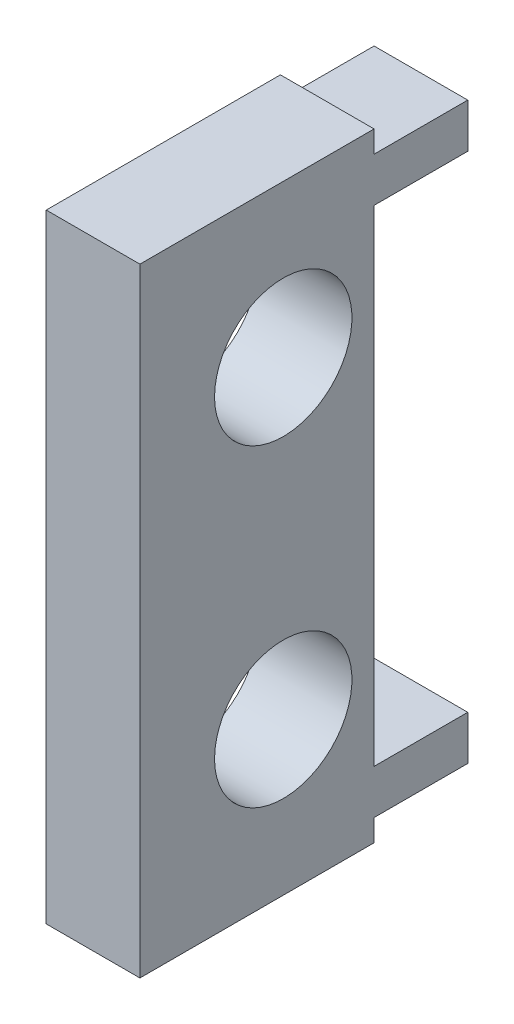
ISO-10303-21;
HEADER;
FILE_DESCRIPTION(('STEP AP214'),'2;1');
FILE_NAME('part.step','',(''),(''),'','','');
FILE_SCHEMA(('AUTOMOTIVE_DESIGN { 1 0 10303 214 1 1 1 1 }'));
ENDSEC;
DATA;
#1=APPLICATION_CONTEXT('core data for automotive mechanical design processes');
#2=APPLICATION_PROTOCOL_DEFINITION('international standard','automotive_design',2000,#1);
#3=PRODUCT_CONTEXT('',#1,'mechanical');
#4=PRODUCT('Part','Part','',(#3));
#5=PRODUCT_RELATED_PRODUCT_CATEGORY('part','',(#4));
#6=PRODUCT_DEFINITION_FORMATION('','',#4);
#7=PRODUCT_DEFINITION_CONTEXT('part definition',#1,'design');
#8=PRODUCT_DEFINITION('design','',#6,#7);
#9=PRODUCT_DEFINITION_SHAPE('','',#8);
#10=(LENGTH_UNIT() NAMED_UNIT(*) SI_UNIT(.MILLI.,.METRE.));
#11=(NAMED_UNIT(*) PLANE_ANGLE_UNIT() SI_UNIT($,.RADIAN.));
#12=(NAMED_UNIT(*) SI_UNIT($,.STERADIAN.) SOLID_ANGLE_UNIT());
#13=UNCERTAINTY_MEASURE_WITH_UNIT(LENGTH_MEASURE(1.E-05),#10,'distance_accuracy_value','');
#14=(GEOMETRIC_REPRESENTATION_CONTEXT(3) GLOBAL_UNCERTAINTY_ASSIGNED_CONTEXT((#13)) GLOBAL_UNIT_ASSIGNED_CONTEXT((#10,
#11,#12)) REPRESENTATION_CONTEXT('',''));
#15=CARTESIAN_POINT('',(0.,0.,0.));
#16=DIRECTION('',(0.,0.,1.));
#17=DIRECTION('',(1.,0.,0.));
#18=AXIS2_PLACEMENT_3D('',#15,#16,#17);
#19=CARTESIAN_POINT('',(0.,0.,0.));
#20=DIRECTION('',(0.,0.,-1.));
#21=DIRECTION('',(-1.,0.,0.));
#22=AXIS2_PLACEMENT_3D('',#19,#20,#21);
#23=PLANE('',#22);
#24=DIRECTION('',(0.,1.,0.));
#25=VECTOR('',#24,1.);
#26=CARTESIAN_POINT('',(1.5,-9.9,0.));
#27=LINE('',#26,#25);
#28=CARTESIAN_POINT('',(1.50000000000004,9.19999999999999,0.));
#29=VERTEX_POINT('',#28);
#30=CARTESIAN_POINT('',(1.5,9.9,0.));
#31=VERTEX_POINT('',#30);
#32=EDGE_CURVE('E176',#29,#31,#27,.T.);
#33=ORIENTED_EDGE('',*,*,#32,.F.);
#34=DIRECTION('',(1.,0.,0.));
#35=VECTOR('',#34,1.);
#36=CARTESIAN_POINT('',(1.50000000000004,9.19999999999999,0.));
#37=LINE('',#36,#35);
#38=CARTESIAN_POINT('',(-1.49999999999996,9.2,0.));
#39=VERTEX_POINT('',#38);
#40=EDGE_CURVE('E144',#39,#29,#37,.T.);
#41=ORIENTED_EDGE('',*,*,#40,.F.);
#42=DIRECTION('',(0.,-1.,0.));
#43=VECTOR('',#42,1.);
#44=CARTESIAN_POINT('',(-1.5,-9.9,0.));
#45=LINE('',#44,#43);
#46=CARTESIAN_POINT('',(-1.5,9.9,0.));
#47=VERTEX_POINT('',#46);
#48=EDGE_CURVE('E193',#47,#39,#45,.T.);
#49=ORIENTED_EDGE('',*,*,#48,.F.);
#50=DIRECTION('',(-1.,0.,0.));
#51=VECTOR('',#50,1.);
#52=CARTESIAN_POINT('',(-1.5,9.9,0.));
#53=LINE('',#52,#51);
#54=EDGE_CURVE('E190',#31,#47,#53,.T.);
#55=ORIENTED_EDGE('',*,*,#54,.F.);
#56=EDGE_LOOP('',(#33,#41,#49,#55));
#57=FACE_BOUND('',#56,.T.);
#58=ADVANCED_FACE('F33',(#57),#23,.T.);
#59=CARTESIAN_POINT('',(-1.5,7.78,0.));
#60=VERTEX_POINT('',#59);
#61=CARTESIAN_POINT('',(-1.5,-7.78,0.));
#62=VERTEX_POINT('',#61);
#63=EDGE_CURVE('E196',#60,#62,#45,.T.);
#64=ORIENTED_EDGE('',*,*,#63,.F.);
#65=DIRECTION('',(-1.,0.,0.));
#66=VECTOR('',#65,1.);
#67=CARTESIAN_POINT('',(1.50000000000004,7.77999999999999,0.));
#68=LINE('',#67,#66);
#69=CARTESIAN_POINT('',(1.50000000000004,7.77999999999999,0.));
#70=VERTEX_POINT('',#69);
#71=EDGE_CURVE('E140',#70,#60,#68,.T.);
#72=ORIENTED_EDGE('',*,*,#71,.F.);
#73=CARTESIAN_POINT('',(1.5,-7.78,0.));
#74=VERTEX_POINT('',#73);
#75=EDGE_CURVE('E191',#74,#70,#27,.T.);
#76=ORIENTED_EDGE('',*,*,#75,.F.);
#77=DIRECTION('',(1.,0.,0.));
#78=VECTOR('',#77,1.);
#79=CARTESIAN_POINT('',(1.5,-7.78,0.));
#80=LINE('',#79,#78);
#81=EDGE_CURVE('E146',#62,#74,#80,.T.);
#82=ORIENTED_EDGE('',*,*,#81,.F.);
#83=EDGE_LOOP('',(#64,#72,#76,#82));
#84=FACE_BOUND('',#83,.T.);
#85=ADVANCED_FACE('F257',(#84),#23,.T.);
#86=DIRECTION('',(-1.,0.,0.));
#87=VECTOR('',#86,1.);
#88=CARTESIAN_POINT('',(1.5,-9.2,0.));
#89=LINE('',#88,#87);
#90=CARTESIAN_POINT('',(1.5,-9.2,0.));
#91=VERTEX_POINT('',#90);
#92=CARTESIAN_POINT('',(-1.5,-9.2,0.));
#93=VERTEX_POINT('',#92);
#94=EDGE_CURVE('E149',#91,#93,#89,.T.);
#95=ORIENTED_EDGE('',*,*,#94,.F.);
#96=CARTESIAN_POINT('',(1.5,-9.9,0.));
#97=VERTEX_POINT('',#96);
#98=EDGE_CURVE('E188',#97,#91,#27,.T.);
#99=ORIENTED_EDGE('',*,*,#98,.F.);
#100=DIRECTION('',(1.,0.,0.));
#101=VECTOR('',#100,1.);
#102=CARTESIAN_POINT('',(-1.5,-9.9,0.));
#103=LINE('',#102,#101);
#104=CARTESIAN_POINT('',(-1.5,-9.9,0.));
#105=VERTEX_POINT('',#104);
#106=EDGE_CURVE('E181',#105,#97,#103,.T.);
#107=ORIENTED_EDGE('',*,*,#106,.F.);
#108=EDGE_CURVE('E56',#93,#105,#45,.T.);
#109=ORIENTED_EDGE('',*,*,#108,.F.);
#110=EDGE_LOOP('',(#95,#99,#107,#109));
#111=FACE_BOUND('',#110,.T.);
#112=ADVANCED_FACE('F259',(#111),#23,.T.);
#113=CARTESIAN_POINT('',(1.5,-9.9,7.5));
#114=DIRECTION('',(-1.,0.,0.));
#115=DIRECTION('',(0.,0.,1.));
#116=AXIS2_PLACEMENT_3D('',#113,#114,#115);
#117=PLANE('',#116);
#118=CARTESIAN_POINT('',(1.5,5.02,2.91));
#119=DIRECTION('',(-1.,0.,0.));
#120=DIRECTION('',(0.,0.,1.));
#121=AXIS2_PLACEMENT_3D('',#118,#119,#120);
#122=CIRCLE('',#121,2.2);
#123=CARTESIAN_POINT('',(1.5,5.02,5.11));
#124=VERTEX_POINT('',#123);
#125=EDGE_CURVE('E223',#124,#124,#122,.T.);
#126=ORIENTED_EDGE('',*,*,#125,.T.);
#127=EDGE_LOOP('',(#126));
#128=FACE_BOUND('',#127,.T.);
#129=CARTESIAN_POINT('',(1.5,-5.02,2.91));
#130=DIRECTION('',(-1.,0.,0.));
#131=DIRECTION('',(0.,0.,1.));
#132=AXIS2_PLACEMENT_3D('',#129,#130,#131);
#133=CIRCLE('',#132,2.2);
#134=CARTESIAN_POINT('',(1.5,-5.02,5.11));
#135=VERTEX_POINT('',#134);
#136=EDGE_CURVE('E211',#135,#135,#133,.T.);
#137=ORIENTED_EDGE('',*,*,#136,.T.);
#138=EDGE_LOOP('',(#137));
#139=FACE_BOUND('',#138,.T.);
#140=ORIENTED_EDGE('',*,*,#98,.T.);
#141=DIRECTION('',(0.,0.,1.));
#142=VECTOR('',#141,1.);
#143=CARTESIAN_POINT('',(1.5,-9.2,-3.));
#144=LINE('',#143,#142);
#145=CARTESIAN_POINT('',(1.5,-9.2,-3.));
#146=VERTEX_POINT('',#145);
#147=EDGE_CURVE('E167',#146,#91,#144,.T.);
#148=ORIENTED_EDGE('',*,*,#147,.F.);
#149=DIRECTION('',(0.,-1.,0.));
#150=VECTOR('',#149,1.);
#151=CARTESIAN_POINT('',(1.5,-9.2,-3.));
#152=LINE('',#151,#150);
#153=CARTESIAN_POINT('',(1.5,-7.78,-3.));
#154=VERTEX_POINT('',#153);
#155=EDGE_CURVE('E159',#154,#146,#152,.T.);
#156=ORIENTED_EDGE('',*,*,#155,.F.);
#157=DIRECTION('',(0.,0.,1.));
#158=VECTOR('',#157,1.);
#159=CARTESIAN_POINT('',(1.5,-7.78,-3.));
#160=LINE('',#159,#158);
#161=EDGE_CURVE('E170',#154,#74,#160,.T.);
#162=ORIENTED_EDGE('',*,*,#161,.T.);
#163=ORIENTED_EDGE('',*,*,#75,.T.);
#164=DIRECTION('',(0.,0.,1.));
#165=VECTOR('',#164,1.);
#166=CARTESIAN_POINT('',(1.50000000000004,7.77999999999999,-3.));
#167=LINE('',#166,#165);
#168=CARTESIAN_POINT('',(1.50000000000004,7.77999999999999,-3.));
#169=VERTEX_POINT('',#168);
#170=EDGE_CURVE('E129',#169,#70,#167,.T.);
#171=ORIENTED_EDGE('',*,*,#170,.F.);
#172=DIRECTION('',(0.,-1.,0.));
#173=VECTOR('',#172,1.);
#174=CARTESIAN_POINT('',(1.50000000000004,9.19999999999999,-3.));
#175=LINE('',#174,#173);
#176=CARTESIAN_POINT('',(1.50000000000004,9.19999999999999,-3.));
#177=VERTEX_POINT('',#176);
#178=EDGE_CURVE('E122',#177,#169,#175,.T.);
#179=ORIENTED_EDGE('',*,*,#178,.F.);
#180=DIRECTION('',(0.,0.,1.));
#181=VECTOR('',#180,1.);
#182=CARTESIAN_POINT('',(1.50000000000004,9.19999999999999,-3.));
#183=LINE('',#182,#181);
#184=EDGE_CURVE('E126',#177,#29,#183,.T.);
#185=ORIENTED_EDGE('',*,*,#184,.T.);
#186=ORIENTED_EDGE('',*,*,#32,.T.);
#187=DIRECTION('',(0.,0.,-1.));
#188=VECTOR('',#187,1.);
#189=CARTESIAN_POINT('',(1.5,9.9,7.5));
#190=LINE('',#189,#188);
#191=CARTESIAN_POINT('',(1.5,9.9,7.5));
#192=VERTEX_POINT('',#191);
#193=EDGE_CURVE('E11',#192,#31,#190,.T.);
#194=ORIENTED_EDGE('',*,*,#193,.F.);
#195=DIRECTION('',(0.,1.,0.));
#196=VECTOR('',#195,1.);
#197=CARTESIAN_POINT('',(1.5,-9.9,7.5));
#198=LINE('',#197,#196);
#199=CARTESIAN_POINT('',(1.5,-9.9,7.5));
#200=VERTEX_POINT('',#199);
#201=EDGE_CURVE('E177',#200,#192,#198,.T.);
#202=ORIENTED_EDGE('',*,*,#201,.F.);
#203=DIRECTION('',(0.,0.,-1.));
#204=VECTOR('',#203,1.);
#205=CARTESIAN_POINT('',(1.5,-9.9,7.5));
#206=LINE('',#205,#204);
#207=EDGE_CURVE('E187',#200,#97,#206,.T.);
#208=ORIENTED_EDGE('',*,*,#207,.T.);
#209=EDGE_LOOP('',(#140,#148,#156,#162,#163,#171,#179,#185,#186,#194,#202,#208));
#210=FACE_BOUND('',#209,.T.);
#211=ADVANCED_FACE('F35',(#128,#139,#210),#117,.F.);
#212=CARTESIAN_POINT('',(-1.5,9.9,7.5));
#213=DIRECTION('',(0.,-1.,0.));
#214=DIRECTION('',(0.,0.,-1.));
#215=AXIS2_PLACEMENT_3D('',#212,#213,#214);
#216=PLANE('',#215);
#217=ORIENTED_EDGE('',*,*,#54,.T.);
#218=DIRECTION('',(0.,0.,-1.));
#219=VECTOR('',#218,1.);
#220=CARTESIAN_POINT('',(-1.5,9.9,7.5));
#221=LINE('',#220,#219);
#222=CARTESIAN_POINT('',(-1.5,9.9,7.5));
#223=VERTEX_POINT('',#222);
#224=EDGE_CURVE('E41',#223,#47,#221,.T.);
#225=ORIENTED_EDGE('',*,*,#224,.F.);
#226=DIRECTION('',(-1.,0.,0.));
#227=VECTOR('',#226,1.);
#228=CARTESIAN_POINT('',(-1.5,9.9,7.5));
#229=LINE('',#228,#227);
#230=EDGE_CURVE('E180',#192,#223,#229,.T.);
#231=ORIENTED_EDGE('',*,*,#230,.F.);
#232=ORIENTED_EDGE('',*,*,#193,.T.);
#233=EDGE_LOOP('',(#217,#225,#231,#232));
#234=FACE_BOUND('',#233,.T.);
#235=ADVANCED_FACE('F243',(#234),#216,.F.);
#236=CARTESIAN_POINT('',(-1.5,-9.9,7.5));
#237=DIRECTION('',(1.,0.,0.));
#238=DIRECTION('',(0.,0.,-1.));
#239=AXIS2_PLACEMENT_3D('',#236,#237,#238);
#240=PLANE('',#239);
#241=CARTESIAN_POINT('',(-1.5,5.02,2.91));
#242=DIRECTION('',(-1.,0.,0.));
#243=DIRECTION('',(0.,0.,1.));
#244=AXIS2_PLACEMENT_3D('',#241,#242,#243);
#245=CIRCLE('',#244,2.2);
#246=CARTESIAN_POINT('',(-1.5,5.02,5.11));
#247=VERTEX_POINT('',#246);
#248=EDGE_CURVE('E225',#247,#247,#245,.T.);
#249=ORIENTED_EDGE('',*,*,#248,.F.);
#250=EDGE_LOOP('',(#249));
#251=FACE_BOUND('',#250,.T.);
#252=CARTESIAN_POINT('',(-1.5,-5.02,2.91));
#253=DIRECTION('',(-1.,0.,0.));
#254=DIRECTION('',(0.,0.,1.));
#255=AXIS2_PLACEMENT_3D('',#252,#253,#254);
#256=CIRCLE('',#255,2.2);
#257=CARTESIAN_POINT('',(-1.5,-5.02,5.11));
#258=VERTEX_POINT('',#257);
#259=EDGE_CURVE('E215',#258,#258,#256,.T.);
#260=ORIENTED_EDGE('',*,*,#259,.F.);
#261=EDGE_LOOP('',(#260));
#262=FACE_BOUND('',#261,.T.);
#263=ORIENTED_EDGE('',*,*,#48,.T.);
#264=DIRECTION('',(0.,0.,1.));
#265=VECTOR('',#264,1.);
#266=CARTESIAN_POINT('',(-1.49999999999996,9.2,-3.));
#267=LINE('',#266,#265);
#268=CARTESIAN_POINT('',(-1.49999999999996,9.2,-3.));
#269=VERTEX_POINT('',#268);
#270=EDGE_CURVE('E220',#269,#39,#267,.T.);
#271=ORIENTED_EDGE('',*,*,#270,.F.);
#272=DIRECTION('',(0.,1.,0.));
#273=VECTOR('',#272,1.);
#274=CARTESIAN_POINT('',(-1.49999999999996,9.2,-3.));
#275=LINE('',#274,#273);
#276=CARTESIAN_POINT('',(-1.49999999999996,7.78,-3.));
#277=VERTEX_POINT('',#276);
#278=EDGE_CURVE('E137',#277,#269,#275,.T.);
#279=ORIENTED_EDGE('',*,*,#278,.F.);
#280=DIRECTION('',(0.,0.,1.));
#281=VECTOR('',#280,1.);
#282=CARTESIAN_POINT('',(-1.49999999999996,7.78,-3.));
#283=LINE('',#282,#281);
#284=EDGE_CURVE('E48',#277,#60,#283,.T.);
#285=ORIENTED_EDGE('',*,*,#284,.T.);
#286=ORIENTED_EDGE('',*,*,#63,.T.);
#287=DIRECTION('',(0.,0.,1.));
#288=VECTOR('',#287,1.);
#289=CARTESIAN_POINT('',(-1.5,-7.78,-3.));
#290=LINE('',#289,#288);
#291=CARTESIAN_POINT('',(-1.5,-7.78,-3.));
#292=VERTEX_POINT('',#291);
#293=EDGE_CURVE('E173',#292,#62,#290,.T.);
#294=ORIENTED_EDGE('',*,*,#293,.F.);
#295=DIRECTION('',(0.,1.,0.));
#296=VECTOR('',#295,1.);
#297=CARTESIAN_POINT('',(-1.5,-9.2,-3.));
#298=LINE('',#297,#296);
#299=CARTESIAN_POINT('',(-1.5,-9.2,-3.));
#300=VERTEX_POINT('',#299);
#301=EDGE_CURVE('E154',#300,#292,#298,.T.);
#302=ORIENTED_EDGE('',*,*,#301,.F.);
#303=DIRECTION('',(0.,0.,1.));
#304=VECTOR('',#303,1.);
#305=CARTESIAN_POINT('',(-1.5,-9.2,-3.));
#306=LINE('',#305,#304);
#307=EDGE_CURVE('E162',#300,#93,#306,.T.);
#308=ORIENTED_EDGE('',*,*,#307,.T.);
#309=ORIENTED_EDGE('',*,*,#108,.T.);
#310=DIRECTION('',(0.,0.,-1.));
#311=VECTOR('',#310,1.);
#312=CARTESIAN_POINT('',(-1.5,-9.9,7.5));
#313=LINE('',#312,#311);
#314=CARTESIAN_POINT('',(-1.5,-9.9,7.5));
#315=VERTEX_POINT('',#314);
#316=EDGE_CURVE('E200',#315,#105,#313,.T.);
#317=ORIENTED_EDGE('',*,*,#316,.F.);
#318=DIRECTION('',(0.,-1.,0.));
#319=VECTOR('',#318,1.);
#320=CARTESIAN_POINT('',(-1.5,-9.9,7.5));
#321=LINE('',#320,#319);
#322=EDGE_CURVE('E183',#223,#315,#321,.T.);
#323=ORIENTED_EDGE('',*,*,#322,.F.);
#324=ORIENTED_EDGE('',*,*,#224,.T.);
#325=EDGE_LOOP('',(#263,#271,#279,#285,#286,#294,#302,#308,#309,#317,#323,#324));
#326=FACE_BOUND('',#325,.T.);
#327=ADVANCED_FACE('F206',(#251,#262,#326),#240,.F.);
#328=CARTESIAN_POINT('',(-1.5,-9.9,7.5));
#329=DIRECTION('',(0.,1.,0.));
#330=DIRECTION('',(0.,0.,1.));
#331=AXIS2_PLACEMENT_3D('',#328,#329,#330);
#332=PLANE('',#331);
#333=ORIENTED_EDGE('',*,*,#106,.T.);
#334=ORIENTED_EDGE('',*,*,#207,.F.);
#335=DIRECTION('',(1.,0.,0.));
#336=VECTOR('',#335,1.);
#337=CARTESIAN_POINT('',(-1.5,-9.9,7.5));
#338=LINE('',#337,#336);
#339=EDGE_CURVE('E185',#315,#200,#338,.T.);
#340=ORIENTED_EDGE('',*,*,#339,.F.);
#341=ORIENTED_EDGE('',*,*,#316,.T.);
#342=EDGE_LOOP('',(#333,#334,#340,#341));
#343=FACE_BOUND('',#342,.T.);
#344=ADVANCED_FACE('F242',(#343),#332,.F.);
#345=CARTESIAN_POINT('',(0.,0.,7.5));
#346=DIRECTION('',(0.,0.,-1.));
#347=DIRECTION('',(-1.,0.,0.));
#348=AXIS2_PLACEMENT_3D('',#345,#346,#347);
#349=PLANE('',#348);
#350=ORIENTED_EDGE('',*,*,#201,.T.);
#351=ORIENTED_EDGE('',*,*,#230,.T.);
#352=ORIENTED_EDGE('',*,*,#322,.T.);
#353=ORIENTED_EDGE('',*,*,#339,.T.);
#354=EDGE_LOOP('',(#350,#351,#352,#353));
#355=FACE_BOUND('',#354,.T.);
#356=ADVANCED_FACE('F291',(#355),#349,.F.);
#357=CARTESIAN_POINT('',(1.5,-7.78,-3.));
#358=DIRECTION('',(0.,-1.,0.));
#359=DIRECTION('',(0.,0.,-1.));
#360=AXIS2_PLACEMENT_3D('',#357,#358,#359);
#361=PLANE('',#360);
#362=ORIENTED_EDGE('',*,*,#81,.T.);
#363=ORIENTED_EDGE('',*,*,#161,.F.);
#364=DIRECTION('',(1.,0.,0.));
#365=VECTOR('',#364,1.);
#366=CARTESIAN_POINT('',(1.5,-7.78,-3.));
#367=LINE('',#366,#365);
#368=EDGE_CURVE('E157',#292,#154,#367,.T.);
#369=ORIENTED_EDGE('',*,*,#368,.F.);
#370=ORIENTED_EDGE('',*,*,#293,.T.);
#371=EDGE_LOOP('',(#362,#363,#369,#370));
#372=FACE_BOUND('',#371,.T.);
#373=ADVANCED_FACE('F285',(#372),#361,.F.);
#374=CARTESIAN_POINT('',(1.5,-9.2,-3.));
#375=DIRECTION('',(0.,1.,0.));
#376=DIRECTION('',(0.,0.,1.));
#377=AXIS2_PLACEMENT_3D('',#374,#375,#376);
#378=PLANE('',#377);
#379=ORIENTED_EDGE('',*,*,#94,.T.);
#380=ORIENTED_EDGE('',*,*,#307,.F.);
#381=DIRECTION('',(-1.,0.,0.));
#382=VECTOR('',#381,1.);
#383=CARTESIAN_POINT('',(1.5,-9.2,-3.));
#384=LINE('',#383,#382);
#385=EDGE_CURVE('E161',#146,#300,#384,.T.);
#386=ORIENTED_EDGE('',*,*,#385,.F.);
#387=ORIENTED_EDGE('',*,*,#147,.T.);
#388=EDGE_LOOP('',(#379,#380,#386,#387));
#389=FACE_BOUND('',#388,.T.);
#390=ADVANCED_FACE('F278',(#389),#378,.F.);
#391=CARTESIAN_POINT('',(0.,0.,-3.));
#392=DIRECTION('',(0.,0.,1.));
#393=DIRECTION('',(1.,0.,0.));
#394=AXIS2_PLACEMENT_3D('',#391,#392,#393);
#395=PLANE('',#394);
#396=ORIENTED_EDGE('',*,*,#301,.T.);
#397=ORIENTED_EDGE('',*,*,#368,.T.);
#398=ORIENTED_EDGE('',*,*,#155,.T.);
#399=ORIENTED_EDGE('',*,*,#385,.T.);
#400=EDGE_LOOP('',(#396,#397,#398,#399));
#401=FACE_BOUND('',#400,.T.);
#402=ADVANCED_FACE('F281',(#401),#395,.F.);
#403=CARTESIAN_POINT('',(1.50000000000004,9.19999999999999,-3.));
#404=DIRECTION('',(0.,-1.,0.));
#405=DIRECTION('',(1.,0.,0.));
#406=AXIS2_PLACEMENT_3D('',#403,#404,#405);
#407=PLANE('',#406);
#408=ORIENTED_EDGE('',*,*,#40,.T.);
#409=ORIENTED_EDGE('',*,*,#184,.F.);
#410=DIRECTION('',(1.,0.,0.));
#411=VECTOR('',#410,1.);
#412=CARTESIAN_POINT('',(1.50000000000004,9.19999999999999,-3.));
#413=LINE('',#412,#411);
#414=EDGE_CURVE('E133',#269,#177,#413,.T.);
#415=ORIENTED_EDGE('',*,*,#414,.F.);
#416=ORIENTED_EDGE('',*,*,#270,.T.);
#417=EDGE_LOOP('',(#408,#409,#415,#416));
#418=FACE_BOUND('',#417,.T.);
#419=ADVANCED_FACE('F142',(#418),#407,.F.);
#420=CARTESIAN_POINT('',(1.50000000000004,7.77999999999999,-3.));
#421=DIRECTION('',(0.,1.,0.));
#422=DIRECTION('',(-1.,0.,0.));
#423=AXIS2_PLACEMENT_3D('',#420,#421,#422);
#424=PLANE('',#423);
#425=ORIENTED_EDGE('',*,*,#71,.T.);
#426=ORIENTED_EDGE('',*,*,#284,.F.);
#427=DIRECTION('',(-1.,0.,0.));
#428=VECTOR('',#427,1.);
#429=CARTESIAN_POINT('',(1.50000000000004,7.77999999999999,-3.));
#430=LINE('',#429,#428);
#431=EDGE_CURVE('E132',#169,#277,#430,.T.);
#432=ORIENTED_EDGE('',*,*,#431,.F.);
#433=ORIENTED_EDGE('',*,*,#170,.T.);
#434=EDGE_LOOP('',(#425,#426,#432,#433));
#435=FACE_BOUND('',#434,.T.);
#436=ADVANCED_FACE('F253',(#435),#424,.F.);
#437=CARTESIAN_POINT('',(0.,0.,-3.));
#438=DIRECTION('',(0.,0.,1.));
#439=DIRECTION('',(1.,0.,0.));
#440=AXIS2_PLACEMENT_3D('',#437,#438,#439);
#441=PLANE('',#440);
#442=ORIENTED_EDGE('',*,*,#414,.T.);
#443=ORIENTED_EDGE('',*,*,#178,.T.);
#444=ORIENTED_EDGE('',*,*,#431,.T.);
#445=ORIENTED_EDGE('',*,*,#278,.T.);
#446=EDGE_LOOP('',(#442,#443,#444,#445));
#447=FACE_BOUND('',#446,.T.);
#448=ADVANCED_FACE('F136',(#447),#441,.F.);
#449=CARTESIAN_POINT('',(1.5,-5.02,2.91));
#450=DIRECTION('',(-1.,0.,0.));
#451=DIRECTION('',(0.,0.,1.));
#452=AXIS2_PLACEMENT_3D('',#449,#450,#451);
#453=CYLINDRICAL_SURFACE('',#452,2.2);
#454=ORIENTED_EDGE('',*,*,#136,.F.);
#455=EDGE_LOOP('',(#454));
#456=FACE_BOUND('',#455,.T.);
#457=ORIENTED_EDGE('',*,*,#259,.T.);
#458=EDGE_LOOP('',(#457));
#459=FACE_BOUND('',#458,.T.);
#460=ADVANCED_FACE('F236',(#456,#459),#453,.F.);
#461=CARTESIAN_POINT('',(1.5,5.02,2.91));
#462=DIRECTION('',(-1.,0.,0.));
#463=DIRECTION('',(0.,0.,1.));
#464=AXIS2_PLACEMENT_3D('',#461,#462,#463);
#465=CYLINDRICAL_SURFACE('',#464,2.2);
#466=ORIENTED_EDGE('',*,*,#125,.F.);
#467=EDGE_LOOP('',(#466));
#468=FACE_BOUND('',#467,.T.);
#469=ORIENTED_EDGE('',*,*,#248,.T.);
#470=EDGE_LOOP('',(#469));
#471=FACE_BOUND('',#470,.T.);
#472=ADVANCED_FACE('F233',(#468,#471),#465,.F.);
#473=CLOSED_SHELL('',(#58,#85,#112,#211,#235,#327,#344,#356,#373,#390,#402,#419,#436,#448,#460,#472));
#474=MANIFOLD_SOLID_BREP('B2',#473);
#475=ADVANCED_BREP_SHAPE_REPRESENTATION('',(#18,#474),#14);
#476=SHAPE_DEFINITION_REPRESENTATION(#9,#475);
ENDSEC;
END-ISO-10303-21;
